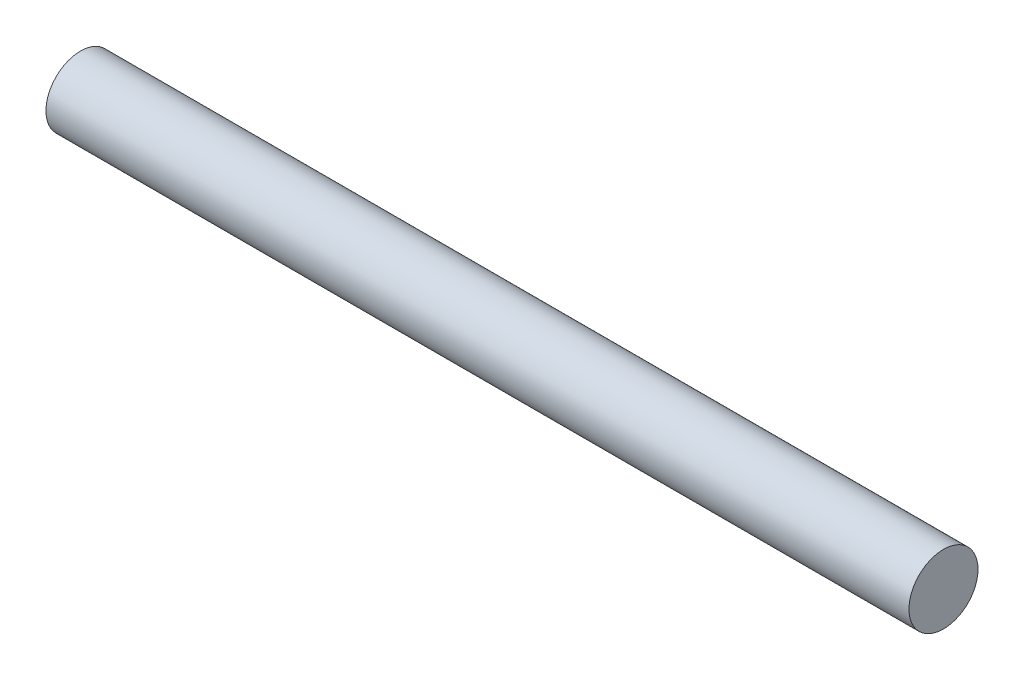
ISO-10303-21;
HEADER;
FILE_DESCRIPTION(('STEP AP214'),'2;1');
FILE_NAME('part.step','',(''),(''),'','','');
FILE_SCHEMA(('AUTOMOTIVE_DESIGN { 1 0 10303 214 1 1 1 1 }'));
ENDSEC;
DATA;
#1=APPLICATION_CONTEXT('core data for automotive mechanical design processes');
#2=APPLICATION_PROTOCOL_DEFINITION('international standard','automotive_design',2000,#1);
#3=PRODUCT_CONTEXT('',#1,'mechanical');
#4=PRODUCT('Part','Part','',(#3));
#5=PRODUCT_RELATED_PRODUCT_CATEGORY('part','',(#4));
#6=PRODUCT_DEFINITION_FORMATION('','',#4);
#7=PRODUCT_DEFINITION_CONTEXT('part definition',#1,'design');
#8=PRODUCT_DEFINITION('design','',#6,#7);
#9=PRODUCT_DEFINITION_SHAPE('','',#8);
#10=(LENGTH_UNIT() NAMED_UNIT(*) SI_UNIT(.MILLI.,.METRE.));
#11=(NAMED_UNIT(*) PLANE_ANGLE_UNIT() SI_UNIT($,.RADIAN.));
#12=(NAMED_UNIT(*) SI_UNIT($,.STERADIAN.) SOLID_ANGLE_UNIT());
#13=UNCERTAINTY_MEASURE_WITH_UNIT(LENGTH_MEASURE(1.E-05),#10,'distance_accuracy_value','');
#14=(GEOMETRIC_REPRESENTATION_CONTEXT(3) GLOBAL_UNCERTAINTY_ASSIGNED_CONTEXT((#13)) GLOBAL_UNIT_ASSIGNED_CONTEXT((#10,
#11,#12)) REPRESENTATION_CONTEXT('',''));
#15=CARTESIAN_POINT('',(0.,0.,0.));
#16=DIRECTION('',(0.,0.,1.));
#17=DIRECTION('',(1.,0.,0.));
#18=AXIS2_PLACEMENT_3D('',#15,#16,#17);
#19=CARTESIAN_POINT('',(100.,0.,0.));
#20=DIRECTION('',(-1.,0.,0.));
#21=DIRECTION('',(0.,0.,1.));
#22=AXIS2_PLACEMENT_3D('',#19,#20,#21);
#23=CYLINDRICAL_SURFACE('',#22,4.);
#24=CARTESIAN_POINT('',(100.,0.,0.));
#25=DIRECTION('',(1.,0.,0.));
#26=DIRECTION('',(0.,0.,-1.));
#27=AXIS2_PLACEMENT_3D('',#24,#25,#26);
#28=CIRCLE('',#27,4.);
#29=CARTESIAN_POINT('',(100.,0.,-4.));
#30=VERTEX_POINT('',#29);
#31=EDGE_CURVE('E10',#30,#30,#28,.T.);
#32=ORIENTED_EDGE('',*,*,#31,.F.);
#33=EDGE_LOOP('',(#32));
#34=FACE_BOUND('',#33,.T.);
#35=CARTESIAN_POINT('',(0.,0.,0.));
#36=DIRECTION('',(1.,0.,0.));
#37=DIRECTION('',(0.,0.,-1.));
#38=AXIS2_PLACEMENT_3D('',#35,#36,#37);
#39=CIRCLE('',#38,4.);
#40=CARTESIAN_POINT('',(0.,0.,-4.));
#41=VERTEX_POINT('',#40);
#42=EDGE_CURVE('E46',#41,#41,#39,.T.);
#43=ORIENTED_EDGE('',*,*,#42,.T.);
#44=EDGE_LOOP('',(#43));
#45=FACE_BOUND('',#44,.T.);
#46=ADVANCED_FACE('F43',(#34,#45),#23,.T.);
#47=CARTESIAN_POINT('',(100.,0.,0.));
#48=DIRECTION('',(1.,0.,0.));
#49=DIRECTION('',(0.,0.,-1.));
#50=AXIS2_PLACEMENT_3D('',#47,#48,#49);
#51=PLANE('',#50);
#52=ORIENTED_EDGE('',*,*,#31,.T.);
#53=EDGE_LOOP('',(#52));
#54=FACE_BOUND('',#53,.T.);
#55=ADVANCED_FACE('F60',(#54),#51,.T.);
#56=CARTESIAN_POINT('',(0.,0.,0.));
#57=DIRECTION('',(1.,0.,0.));
#58=DIRECTION('',(0.,0.,-1.));
#59=AXIS2_PLACEMENT_3D('',#56,#57,#58);
#60=PLANE('',#59);
#61=ORIENTED_EDGE('',*,*,#42,.F.);
#62=EDGE_LOOP('',(#61));
#63=FACE_BOUND('',#62,.T.);
#64=ADVANCED_FACE('F58',(#63),#60,.F.);
#65=CLOSED_SHELL('',(#46,#55,#64));
#66=MANIFOLD_SOLID_BREP('B2',#65);
#67=ADVANCED_BREP_SHAPE_REPRESENTATION('',(#18,#66),#14);
#68=SHAPE_DEFINITION_REPRESENTATION(#9,#67);
ENDSEC;
END-ISO-10303-21;
